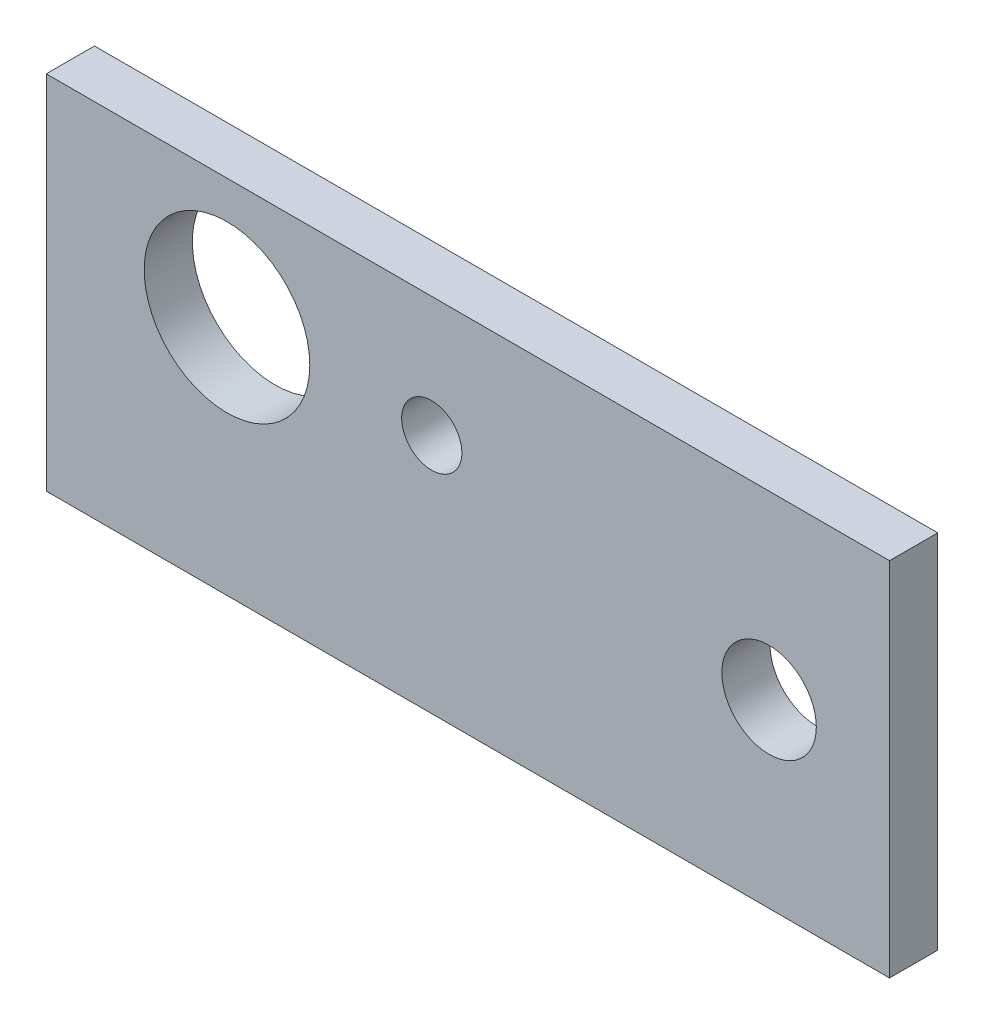
ISO-10303-21;
HEADER;
FILE_DESCRIPTION(('STEP AP214'),'2;1');
FILE_NAME('part.step','',(''),(''),'','','');
FILE_SCHEMA(('AUTOMOTIVE_DESIGN { 1 0 10303 214 1 1 1 1 }'));
ENDSEC;
DATA;
#1=APPLICATION_CONTEXT('core data for automotive mechanical design processes');
#2=APPLICATION_PROTOCOL_DEFINITION('international standard','automotive_design',2000,#1);
#3=PRODUCT_CONTEXT('',#1,'mechanical');
#4=PRODUCT('Part','Part','',(#3));
#5=PRODUCT_RELATED_PRODUCT_CATEGORY('part','',(#4));
#6=PRODUCT_DEFINITION_FORMATION('','',#4);
#7=PRODUCT_DEFINITION_CONTEXT('part definition',#1,'design');
#8=PRODUCT_DEFINITION('design','',#6,#7);
#9=PRODUCT_DEFINITION_SHAPE('','',#8);
#10=(LENGTH_UNIT() NAMED_UNIT(*) SI_UNIT(.MILLI.,.METRE.));
#11=(NAMED_UNIT(*) PLANE_ANGLE_UNIT() SI_UNIT($,.RADIAN.));
#12=(NAMED_UNIT(*) SI_UNIT($,.STERADIAN.) SOLID_ANGLE_UNIT());
#13=UNCERTAINTY_MEASURE_WITH_UNIT(LENGTH_MEASURE(1.E-05),#10,'distance_accuracy_value','');
#14=(GEOMETRIC_REPRESENTATION_CONTEXT(3) GLOBAL_UNCERTAINTY_ASSIGNED_CONTEXT((#13)) GLOBAL_UNIT_ASSIGNED_CONTEXT((#10,
#11,#12)) REPRESENTATION_CONTEXT('',''));
#15=CARTESIAN_POINT('',(0.,0.,0.));
#16=DIRECTION('',(0.,0.,1.));
#17=DIRECTION('',(1.,0.,0.));
#18=AXIS2_PLACEMENT_3D('',#15,#16,#17);
#19=CARTESIAN_POINT('',(22.225,9.525,2.54));
#20=DIRECTION('',(-1.,0.,0.));
#21=DIRECTION('',(0.,-1.,0.));
#22=AXIS2_PLACEMENT_3D('',#19,#20,#21);
#23=PLANE('',#22);
#24=DIRECTION('',(0.,1.,0.));
#25=VECTOR('',#24,1.);
#26=CARTESIAN_POINT('',(22.225,9.525,0.));
#27=LINE('',#26,#25);
#28=CARTESIAN_POINT('',(22.225,-9.525,0.));
#29=VERTEX_POINT('',#28);
#30=CARTESIAN_POINT('',(22.225,9.525,0.));
#31=VERTEX_POINT('',#30);
#32=EDGE_CURVE('E96',#29,#31,#27,.T.);
#33=ORIENTED_EDGE('',*,*,#32,.T.);
#34=DIRECTION('',(0.,0.,-1.));
#35=VECTOR('',#34,1.);
#36=CARTESIAN_POINT('',(22.225,9.525,2.54));
#37=LINE('',#36,#35);
#38=CARTESIAN_POINT('',(22.225,9.525,2.54));
#39=VERTEX_POINT('',#38);
#40=EDGE_CURVE('E11',#39,#31,#37,.T.);
#41=ORIENTED_EDGE('',*,*,#40,.F.);
#42=DIRECTION('',(0.,1.,0.));
#43=VECTOR('',#42,1.);
#44=CARTESIAN_POINT('',(22.225,9.525,2.54));
#45=LINE('',#44,#43);
#46=CARTESIAN_POINT('',(22.225,-9.525,2.54));
#47=VERTEX_POINT('',#46);
#48=EDGE_CURVE('E84',#47,#39,#45,.T.);
#49=ORIENTED_EDGE('',*,*,#48,.F.);
#50=DIRECTION('',(0.,0.,-1.));
#51=VECTOR('',#50,1.);
#52=CARTESIAN_POINT('',(22.225,-9.525,2.54));
#53=LINE('',#52,#51);
#54=EDGE_CURVE('E92',#47,#29,#53,.T.);
#55=ORIENTED_EDGE('',*,*,#54,.T.);
#56=EDGE_LOOP('',(#33,#41,#49,#55));
#57=FACE_BOUND('',#56,.T.);
#58=ADVANCED_FACE('F33',(#57),#23,.F.);
#59=CARTESIAN_POINT('',(-22.225,9.525,2.54));
#60=DIRECTION('',(0.,-1.,0.));
#61=DIRECTION('',(0.,0.,-1.));
#62=AXIS2_PLACEMENT_3D('',#59,#60,#61);
#63=PLANE('',#62);
#64=DIRECTION('',(-1.,0.,0.));
#65=VECTOR('',#64,1.);
#66=CARTESIAN_POINT('',(-22.225,9.525,0.));
#67=LINE('',#66,#65);
#68=CARTESIAN_POINT('',(-22.225,9.525,0.));
#69=VERTEX_POINT('',#68);
#70=EDGE_CURVE('E88',#31,#69,#67,.T.);
#71=ORIENTED_EDGE('',*,*,#70,.T.);
#72=DIRECTION('',(0.,0.,-1.));
#73=VECTOR('',#72,1.);
#74=CARTESIAN_POINT('',(-22.225,9.525,2.54));
#75=LINE('',#74,#73);
#76=CARTESIAN_POINT('',(-22.225,9.525,2.54));
#77=VERTEX_POINT('',#76);
#78=EDGE_CURVE('E41',#77,#69,#75,.T.);
#79=ORIENTED_EDGE('',*,*,#78,.F.);
#80=DIRECTION('',(-1.,0.,0.));
#81=VECTOR('',#80,1.);
#82=CARTESIAN_POINT('',(-22.225,9.525,2.54));
#83=LINE('',#82,#81);
#84=EDGE_CURVE('E79',#39,#77,#83,.T.);
#85=ORIENTED_EDGE('',*,*,#84,.F.);
#86=ORIENTED_EDGE('',*,*,#40,.T.);
#87=EDGE_LOOP('',(#71,#79,#85,#86));
#88=FACE_BOUND('',#87,.T.);
#89=ADVANCED_FACE('F87',(#88),#63,.F.);
#90=CARTESIAN_POINT('',(-22.225,9.525,2.54));
#91=DIRECTION('',(1.,0.,0.));
#92=DIRECTION('',(0.,1.,0.));
#93=AXIS2_PLACEMENT_3D('',#90,#91,#92);
#94=PLANE('',#93);
#95=DIRECTION('',(0.,-1.,0.));
#96=VECTOR('',#95,1.);
#97=CARTESIAN_POINT('',(-22.225,9.525,0.));
#98=LINE('',#97,#96);
#99=CARTESIAN_POINT('',(-22.225,-9.525,0.));
#100=VERTEX_POINT('',#99);
#101=EDGE_CURVE('E66',#69,#100,#98,.T.);
#102=ORIENTED_EDGE('',*,*,#101,.T.);
#103=DIRECTION('',(0.,0.,-1.));
#104=VECTOR('',#103,1.);
#105=CARTESIAN_POINT('',(-22.225,-9.525,2.54));
#106=LINE('',#105,#104);
#107=CARTESIAN_POINT('',(-22.225,-9.525,2.54));
#108=VERTEX_POINT('',#107);
#109=EDGE_CURVE('E89',#108,#100,#106,.T.);
#110=ORIENTED_EDGE('',*,*,#109,.F.);
#111=DIRECTION('',(0.,-1.,0.));
#112=VECTOR('',#111,1.);
#113=CARTESIAN_POINT('',(-22.225,9.525,2.54));
#114=LINE('',#113,#112);
#115=EDGE_CURVE('E82',#77,#108,#114,.T.);
#116=ORIENTED_EDGE('',*,*,#115,.F.);
#117=ORIENTED_EDGE('',*,*,#78,.T.);
#118=EDGE_LOOP('',(#102,#110,#116,#117));
#119=FACE_BOUND('',#118,.T.);
#120=ADVANCED_FACE('F90',(#119),#94,.F.);
#121=CARTESIAN_POINT('',(-22.225,-9.525,2.54));
#122=DIRECTION('',(0.,1.,0.));
#123=DIRECTION('',(0.,0.,1.));
#124=AXIS2_PLACEMENT_3D('',#121,#122,#123);
#125=PLANE('',#124);
#126=DIRECTION('',(1.,0.,0.));
#127=VECTOR('',#126,1.);
#128=CARTESIAN_POINT('',(-22.225,-9.525,0.));
#129=LINE('',#128,#127);
#130=EDGE_CURVE('E72',#100,#29,#129,.T.);
#131=ORIENTED_EDGE('',*,*,#130,.T.);
#132=ORIENTED_EDGE('',*,*,#54,.F.);
#133=DIRECTION('',(1.,0.,0.));
#134=VECTOR('',#133,1.);
#135=CARTESIAN_POINT('',(-22.225,-9.525,2.54));
#136=LINE('',#135,#134);
#137=EDGE_CURVE('E49',#108,#47,#136,.T.);
#138=ORIENTED_EDGE('',*,*,#137,.F.);
#139=ORIENTED_EDGE('',*,*,#109,.T.);
#140=EDGE_LOOP('',(#131,#132,#138,#139));
#141=FACE_BOUND('',#140,.T.);
#142=ADVANCED_FACE('F104',(#141),#125,.F.);
#143=CARTESIAN_POINT('',(0.,0.,2.54));
#144=DIRECTION('',(0.,0.,1.));
#145=DIRECTION('',(1.,0.,0.));
#146=AXIS2_PLACEMENT_3D('',#143,#144,#145);
#147=PLANE('',#146);
#148=CARTESIAN_POINT('',(-1.905,3.175,2.54));
#149=DIRECTION('',(0.,0.,1.));
#150=DIRECTION('',(1.,0.,0.));
#151=AXIS2_PLACEMENT_3D('',#148,#149,#150);
#152=CIRCLE('',#151,1.5875);
#153=CARTESIAN_POINT('',(-0.317500000000002,3.175,2.54));
#154=VERTEX_POINT('',#153);
#155=EDGE_CURVE('E124',#154,#154,#152,.T.);
#156=ORIENTED_EDGE('',*,*,#155,.F.);
#157=EDGE_LOOP('',(#156));
#158=FACE_BOUND('',#157,.T.);
#159=CARTESIAN_POINT('',(15.875,0.,2.54));
#160=DIRECTION('',(0.,0.,1.));
#161=DIRECTION('',(1.,0.,0.));
#162=AXIS2_PLACEMENT_3D('',#159,#160,#161);
#163=CIRCLE('',#162,2.4892);
#164=CARTESIAN_POINT('',(18.3642,0.,2.54));
#165=VERTEX_POINT('',#164);
#166=EDGE_CURVE('E118',#165,#165,#163,.T.);
#167=ORIENTED_EDGE('',*,*,#166,.F.);
#168=EDGE_LOOP('',(#167));
#169=FACE_BOUND('',#168,.T.);
#170=CARTESIAN_POINT('',(-12.7,3.175,2.54));
#171=DIRECTION('',(0.,0.,1.));
#172=DIRECTION('',(1.,0.,0.));
#173=AXIS2_PLACEMENT_3D('',#170,#171,#172);
#174=CIRCLE('',#173,4.365625);
#175=CARTESIAN_POINT('',(-8.334375,3.175,2.54));
#176=VERTEX_POINT('',#175);
#177=EDGE_CURVE('E112',#176,#176,#174,.T.);
#178=ORIENTED_EDGE('',*,*,#177,.F.);
#179=EDGE_LOOP('',(#178));
#180=FACE_BOUND('',#179,.T.);
#181=ORIENTED_EDGE('',*,*,#48,.T.);
#182=ORIENTED_EDGE('',*,*,#84,.T.);
#183=ORIENTED_EDGE('',*,*,#115,.T.);
#184=ORIENTED_EDGE('',*,*,#137,.T.);
#185=EDGE_LOOP('',(#181,#182,#183,#184));
#186=FACE_BOUND('',#185,.T.);
#187=ADVANCED_FACE('F80',(#158,#169,#180,#186),#147,.T.);
#188=CARTESIAN_POINT('',(0.,0.,0.));
#189=DIRECTION('',(0.,0.,1.));
#190=DIRECTION('',(1.,0.,0.));
#191=AXIS2_PLACEMENT_3D('',#188,#189,#190);
#192=PLANE('',#191);
#193=CARTESIAN_POINT('',(-1.905,3.175,0.));
#194=DIRECTION('',(0.,0.,1.));
#195=DIRECTION('',(1.,0.,0.));
#196=AXIS2_PLACEMENT_3D('',#193,#194,#195);
#197=CIRCLE('',#196,1.5875);
#198=CARTESIAN_POINT('',(-0.317500000000002,3.175,0.));
#199=VERTEX_POINT('',#198);
#200=EDGE_CURVE('E121',#199,#199,#197,.F.);
#201=ORIENTED_EDGE('',*,*,#200,.F.);
#202=EDGE_LOOP('',(#201));
#203=FACE_BOUND('',#202,.T.);
#204=CARTESIAN_POINT('',(15.875,0.,0.));
#205=DIRECTION('',(0.,0.,1.));
#206=DIRECTION('',(1.,0.,0.));
#207=AXIS2_PLACEMENT_3D('',#204,#205,#206);
#208=CIRCLE('',#207,2.4892);
#209=CARTESIAN_POINT('',(18.3642,0.,0.));
#210=VERTEX_POINT('',#209);
#211=EDGE_CURVE('E115',#210,#210,#208,.F.);
#212=ORIENTED_EDGE('',*,*,#211,.F.);
#213=EDGE_LOOP('',(#212));
#214=FACE_BOUND('',#213,.T.);
#215=CARTESIAN_POINT('',(-12.7,3.175,0.));
#216=DIRECTION('',(0.,0.,1.));
#217=DIRECTION('',(1.,0.,0.));
#218=AXIS2_PLACEMENT_3D('',#215,#216,#217);
#219=CIRCLE('',#218,4.365625);
#220=CARTESIAN_POINT('',(-8.334375,3.175,0.));
#221=VERTEX_POINT('',#220);
#222=EDGE_CURVE('E99',#221,#221,#219,.F.);
#223=ORIENTED_EDGE('',*,*,#222,.F.);
#224=EDGE_LOOP('',(#223));
#225=FACE_BOUND('',#224,.T.);
#226=ORIENTED_EDGE('',*,*,#32,.F.);
#227=ORIENTED_EDGE('',*,*,#130,.F.);
#228=ORIENTED_EDGE('',*,*,#101,.F.);
#229=ORIENTED_EDGE('',*,*,#70,.F.);
#230=EDGE_LOOP('',(#226,#227,#228,#229));
#231=FACE_BOUND('',#230,.T.);
#232=ADVANCED_FACE('F107',(#203,#214,#225,#231),#192,.F.);
#233=CARTESIAN_POINT('',(-12.7,3.175,-0.00100000000000013));
#234=DIRECTION('',(0.,0.,1.));
#235=DIRECTION('',(1.,0.,0.));
#236=AXIS2_PLACEMENT_3D('',#233,#234,#235);
#237=CYLINDRICAL_SURFACE('',#236,4.365625);
#238=ORIENTED_EDGE('',*,*,#177,.T.);
#239=EDGE_LOOP('',(#238));
#240=FACE_BOUND('',#239,.T.);
#241=ORIENTED_EDGE('',*,*,#222,.T.);
#242=EDGE_LOOP('',(#241));
#243=FACE_BOUND('',#242,.T.);
#244=ADVANCED_FACE('F138',(#240,#243),#237,.F.);
#245=CARTESIAN_POINT('',(15.875,0.,-0.00100000000000013));
#246=DIRECTION('',(0.,0.,1.));
#247=DIRECTION('',(1.,0.,0.));
#248=AXIS2_PLACEMENT_3D('',#245,#246,#247);
#249=CYLINDRICAL_SURFACE('',#248,2.4892);
#250=ORIENTED_EDGE('',*,*,#166,.T.);
#251=EDGE_LOOP('',(#250));
#252=FACE_BOUND('',#251,.T.);
#253=ORIENTED_EDGE('',*,*,#211,.T.);
#254=EDGE_LOOP('',(#253));
#255=FACE_BOUND('',#254,.T.);
#256=ADVANCED_FACE('F141',(#252,#255),#249,.F.);
#257=CARTESIAN_POINT('',(-1.905,3.175,-0.00100000000000013));
#258=DIRECTION('',(0.,0.,1.));
#259=DIRECTION('',(1.,0.,0.));
#260=AXIS2_PLACEMENT_3D('',#257,#258,#259);
#261=CYLINDRICAL_SURFACE('',#260,1.5875);
#262=ORIENTED_EDGE('',*,*,#155,.T.);
#263=EDGE_LOOP('',(#262));
#264=FACE_BOUND('',#263,.T.);
#265=ORIENTED_EDGE('',*,*,#200,.T.);
#266=EDGE_LOOP('',(#265));
#267=FACE_BOUND('',#266,.T.);
#268=ADVANCED_FACE('F128',(#264,#267),#261,.F.);
#269=CLOSED_SHELL('',(#58,#89,#120,#142,#187,#232,#244,#256,#268));
#270=MANIFOLD_SOLID_BREP('B2',#269);
#271=ADVANCED_BREP_SHAPE_REPRESENTATION('',(#18,#270),#14);
#272=SHAPE_DEFINITION_REPRESENTATION(#9,#271);
ENDSEC;
END-ISO-10303-21;
